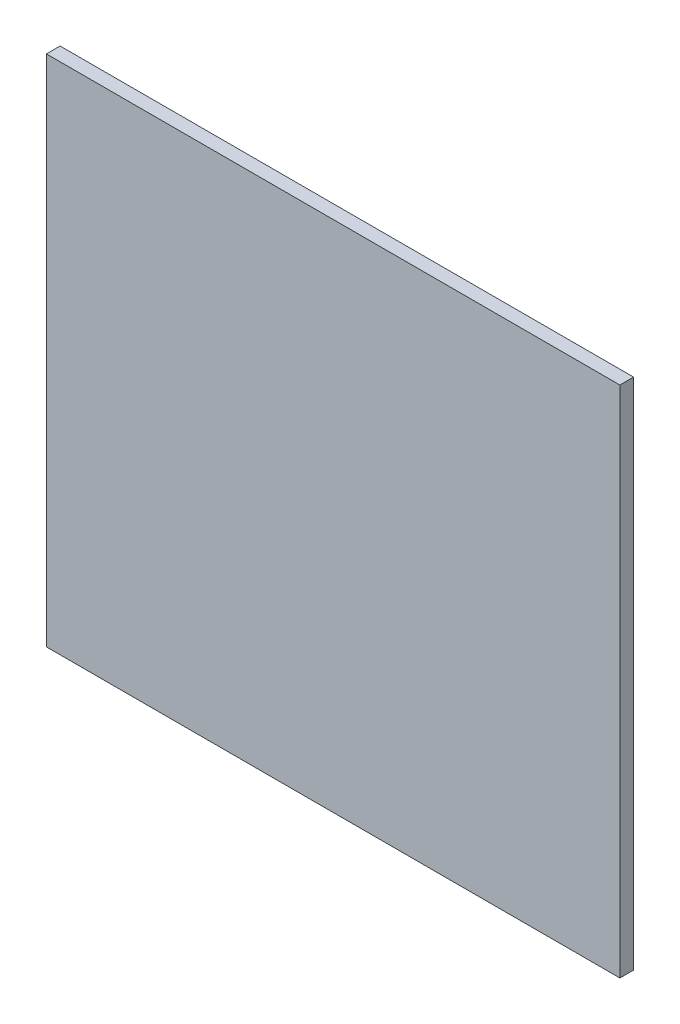
ISO-10303-21;
HEADER;
FILE_DESCRIPTION(('STEP AP214'),'2;1');
FILE_NAME('part.step','',(''),(''),'','','');
FILE_SCHEMA(('AUTOMOTIVE_DESIGN { 1 0 10303 214 1 1 1 1 }'));
ENDSEC;
DATA;
#1=APPLICATION_CONTEXT('core data for automotive mechanical design processes');
#2=APPLICATION_PROTOCOL_DEFINITION('international standard','automotive_design',2000,#1);
#3=PRODUCT_CONTEXT('',#1,'mechanical');
#4=PRODUCT('Part','Part','',(#3));
#5=PRODUCT_RELATED_PRODUCT_CATEGORY('part','',(#4));
#6=PRODUCT_DEFINITION_FORMATION('','',#4);
#7=PRODUCT_DEFINITION_CONTEXT('part definition',#1,'design');
#8=PRODUCT_DEFINITION('design','',#6,#7);
#9=PRODUCT_DEFINITION_SHAPE('','',#8);
#10=(LENGTH_UNIT() NAMED_UNIT(*) SI_UNIT(.MILLI.,.METRE.));
#11=(NAMED_UNIT(*) PLANE_ANGLE_UNIT() SI_UNIT($,.RADIAN.));
#12=(NAMED_UNIT(*) SI_UNIT($,.STERADIAN.) SOLID_ANGLE_UNIT());
#13=UNCERTAINTY_MEASURE_WITH_UNIT(LENGTH_MEASURE(1.E-05),#10,'distance_accuracy_value','');
#14=(GEOMETRIC_REPRESENTATION_CONTEXT(3) GLOBAL_UNCERTAINTY_ASSIGNED_CONTEXT((#13)) GLOBAL_UNIT_ASSIGNED_CONTEXT((#10,
#11,#12)) REPRESENTATION_CONTEXT('',''));
#15=CARTESIAN_POINT('',(0.,0.,0.));
#16=DIRECTION('',(0.,0.,1.));
#17=DIRECTION('',(1.,0.,0.));
#18=AXIS2_PLACEMENT_3D('',#15,#16,#17);
#19=CARTESIAN_POINT('',(106.3625,95.25,5.08));
#20=DIRECTION('',(-1.,0.,0.));
#21=DIRECTION('',(0.,-1.,0.));
#22=AXIS2_PLACEMENT_3D('',#19,#20,#21);
#23=PLANE('',#22);
#24=DIRECTION('',(0.,1.,0.));
#25=VECTOR('',#24,1.);
#26=CARTESIAN_POINT('',(106.3625,95.25,0.));
#27=LINE('',#26,#25);
#28=CARTESIAN_POINT('',(106.3625,-95.25,0.));
#29=VERTEX_POINT('',#28);
#30=CARTESIAN_POINT('',(106.3625,95.25,0.));
#31=VERTEX_POINT('',#30);
#32=EDGE_CURVE('E111',#29,#31,#27,.T.);
#33=ORIENTED_EDGE('',*,*,#32,.T.);
#34=DIRECTION('',(0.,0.,-1.));
#35=VECTOR('',#34,1.);
#36=CARTESIAN_POINT('',(106.3625,95.25,5.08));
#37=LINE('',#36,#35);
#38=CARTESIAN_POINT('',(106.3625,95.25,5.08));
#39=VERTEX_POINT('',#38);
#40=EDGE_CURVE('E11',#39,#31,#37,.T.);
#41=ORIENTED_EDGE('',*,*,#40,.F.);
#42=DIRECTION('',(0.,1.,0.));
#43=VECTOR('',#42,1.);
#44=CARTESIAN_POINT('',(106.3625,95.25,5.08));
#45=LINE('',#44,#43);
#46=CARTESIAN_POINT('',(106.3625,-95.25,5.08));
#47=VERTEX_POINT('',#46);
#48=EDGE_CURVE('E95',#47,#39,#45,.T.);
#49=ORIENTED_EDGE('',*,*,#48,.F.);
#50=DIRECTION('',(0.,0.,-1.));
#51=VECTOR('',#50,1.);
#52=CARTESIAN_POINT('',(106.3625,-95.25,5.08));
#53=LINE('',#52,#51);
#54=EDGE_CURVE('E107',#47,#29,#53,.T.);
#55=ORIENTED_EDGE('',*,*,#54,.T.);
#56=EDGE_LOOP('',(#33,#41,#49,#55));
#57=FACE_BOUND('',#56,.T.);
#58=ADVANCED_FACE('F43',(#57),#23,.F.);
#59=CARTESIAN_POINT('',(-106.3625,95.25,5.08));
#60=DIRECTION('',(0.,-1.,0.));
#61=DIRECTION('',(0.,0.,-1.));
#62=AXIS2_PLACEMENT_3D('',#59,#60,#61);
#63=PLANE('',#62);
#64=DIRECTION('',(-1.,0.,0.));
#65=VECTOR('',#64,1.);
#66=CARTESIAN_POINT('',(-106.3625,95.25,0.));
#67=LINE('',#66,#65);
#68=CARTESIAN_POINT('',(-106.3625,95.25,0.));
#69=VERTEX_POINT('',#68);
#70=EDGE_CURVE('E100',#31,#69,#67,.T.);
#71=ORIENTED_EDGE('',*,*,#70,.T.);
#72=DIRECTION('',(0.,0.,-1.));
#73=VECTOR('',#72,1.);
#74=CARTESIAN_POINT('',(-106.3625,95.25,5.08));
#75=LINE('',#74,#73);
#76=CARTESIAN_POINT('',(-106.3625,95.25,5.08));
#77=VERTEX_POINT('',#76);
#78=EDGE_CURVE('E52',#77,#69,#75,.T.);
#79=ORIENTED_EDGE('',*,*,#78,.F.);
#80=DIRECTION('',(-1.,0.,0.));
#81=VECTOR('',#80,1.);
#82=CARTESIAN_POINT('',(-106.3625,95.25,5.08));
#83=LINE('',#82,#81);
#84=EDGE_CURVE('E90',#39,#77,#83,.T.);
#85=ORIENTED_EDGE('',*,*,#84,.F.);
#86=ORIENTED_EDGE('',*,*,#40,.T.);
#87=EDGE_LOOP('',(#71,#79,#85,#86));
#88=FACE_BOUND('',#87,.T.);
#89=ADVANCED_FACE('F99',(#88),#63,.F.);
#90=CARTESIAN_POINT('',(-106.3625,95.25,5.08));
#91=DIRECTION('',(1.,0.,0.));
#92=DIRECTION('',(0.,1.,0.));
#93=AXIS2_PLACEMENT_3D('',#90,#91,#92);
#94=PLANE('',#93);
#95=DIRECTION('',(0.,-1.,0.));
#96=VECTOR('',#95,1.);
#97=CARTESIAN_POINT('',(-106.3625,95.25,0.));
#98=LINE('',#97,#96);
#99=CARTESIAN_POINT('',(-106.3625,-95.25,0.));
#100=VERTEX_POINT('',#99);
#101=EDGE_CURVE('E77',#69,#100,#98,.T.);
#102=ORIENTED_EDGE('',*,*,#101,.T.);
#103=DIRECTION('',(0.,0.,-1.));
#104=VECTOR('',#103,1.);
#105=CARTESIAN_POINT('',(-106.3625,-95.25,5.08));
#106=LINE('',#105,#104);
#107=CARTESIAN_POINT('',(-106.3625,-95.25,5.08));
#108=VERTEX_POINT('',#107);
#109=EDGE_CURVE('E102',#108,#100,#106,.T.);
#110=ORIENTED_EDGE('',*,*,#109,.F.);
#111=DIRECTION('',(0.,-1.,0.));
#112=VECTOR('',#111,1.);
#113=CARTESIAN_POINT('',(-106.3625,95.25,5.08));
#114=LINE('',#113,#112);
#115=EDGE_CURVE('E93',#77,#108,#114,.T.);
#116=ORIENTED_EDGE('',*,*,#115,.F.);
#117=ORIENTED_EDGE('',*,*,#78,.T.);
#118=EDGE_LOOP('',(#102,#110,#116,#117));
#119=FACE_BOUND('',#118,.T.);
#120=ADVANCED_FACE('F103',(#119),#94,.F.);
#121=CARTESIAN_POINT('',(-106.3625,-95.25,5.08));
#122=DIRECTION('',(0.,1.,0.));
#123=DIRECTION('',(0.,0.,1.));
#124=AXIS2_PLACEMENT_3D('',#121,#122,#123);
#125=PLANE('',#124);
#126=DIRECTION('',(1.,0.,0.));
#127=VECTOR('',#126,1.);
#128=CARTESIAN_POINT('',(-106.3625,-95.25,0.));
#129=LINE('',#128,#127);
#130=EDGE_CURVE('E83',#100,#29,#129,.T.);
#131=ORIENTED_EDGE('',*,*,#130,.T.);
#132=ORIENTED_EDGE('',*,*,#54,.F.);
#133=DIRECTION('',(1.,0.,0.));
#134=VECTOR('',#133,1.);
#135=CARTESIAN_POINT('',(-106.3625,-95.25,5.08));
#136=LINE('',#135,#134);
#137=EDGE_CURVE('E60',#108,#47,#136,.T.);
#138=ORIENTED_EDGE('',*,*,#137,.F.);
#139=ORIENTED_EDGE('',*,*,#109,.T.);
#140=EDGE_LOOP('',(#131,#132,#138,#139));
#141=FACE_BOUND('',#140,.T.);
#142=ADVANCED_FACE('F124',(#141),#125,.F.);
#143=CARTESIAN_POINT('',(0.,0.,5.08));
#144=DIRECTION('',(0.,0.,1.));
#145=DIRECTION('',(1.,0.,0.));
#146=AXIS2_PLACEMENT_3D('',#143,#144,#145);
#147=PLANE('',#146);
#148=ORIENTED_EDGE('',*,*,#48,.T.);
#149=ORIENTED_EDGE('',*,*,#84,.T.);
#150=ORIENTED_EDGE('',*,*,#115,.T.);
#151=ORIENTED_EDGE('',*,*,#137,.T.);
#152=EDGE_LOOP('',(#148,#149,#150,#151));
#153=FACE_BOUND('',#152,.T.);
#154=ADVANCED_FACE('F91',(#153),#147,.T.);
#155=CARTESIAN_POINT('',(0.,0.,0.));
#156=DIRECTION('',(0.,0.,1.));
#157=DIRECTION('',(1.,0.,0.));
#158=AXIS2_PLACEMENT_3D('',#155,#156,#157);
#159=PLANE('',#158);
#160=ORIENTED_EDGE('',*,*,#32,.F.);
#161=ORIENTED_EDGE('',*,*,#130,.F.);
#162=ORIENTED_EDGE('',*,*,#101,.F.);
#163=ORIENTED_EDGE('',*,*,#70,.F.);
#164=EDGE_LOOP('',(#160,#161,#162,#163));
#165=FACE_BOUND('',#164,.T.);
#166=ADVANCED_FACE('F127',(#165),#159,.F.);
#167=CLOSED_SHELL('',(#58,#89,#120,#142,#154,#166));
#168=MANIFOLD_SOLID_BREP('B2',#167);
#169=ADVANCED_BREP_SHAPE_REPRESENTATION('',(#18,#168),#14);
#170=SHAPE_DEFINITION_REPRESENTATION(#9,#169);
ENDSEC;
END-ISO-10303-21;
